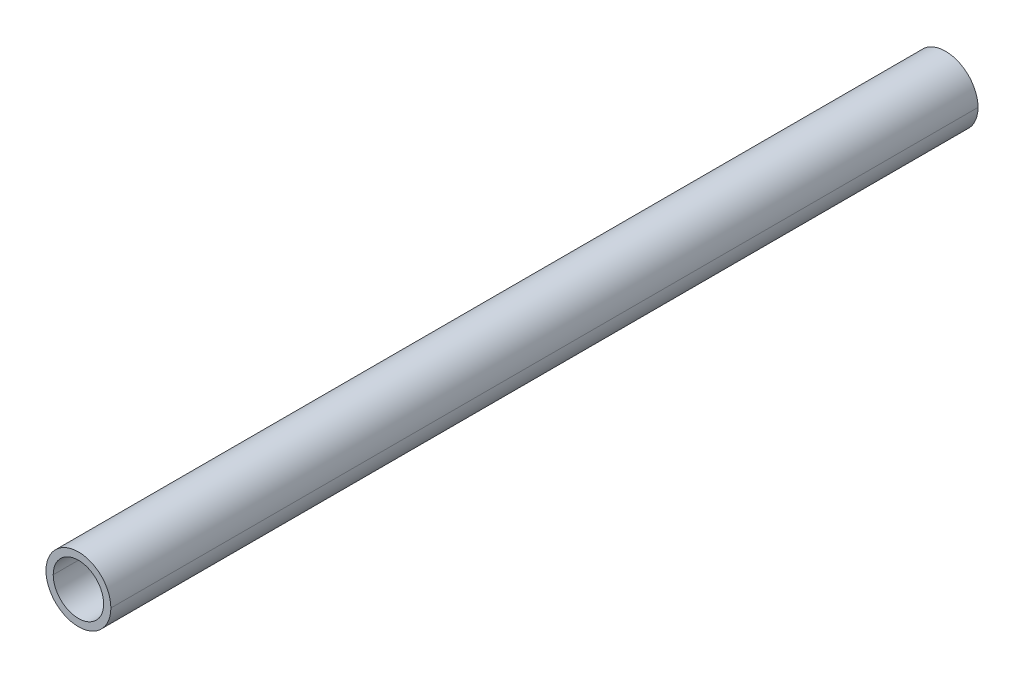
ISO-10303-21;
HEADER;
FILE_DESCRIPTION(('STEP AP214'),'2;1');
FILE_NAME('part.step','',(''),(''),'','','');
FILE_SCHEMA(('AUTOMOTIVE_DESIGN { 1 0 10303 214 1 1 1 1 }'));
ENDSEC;
DATA;
#1=APPLICATION_CONTEXT('core data for automotive mechanical design processes');
#2=APPLICATION_PROTOCOL_DEFINITION('international standard','automotive_design',2000,#1);
#3=PRODUCT_CONTEXT('',#1,'mechanical');
#4=PRODUCT('Part','Part','',(#3));
#5=PRODUCT_RELATED_PRODUCT_CATEGORY('part','',(#4));
#6=PRODUCT_DEFINITION_FORMATION('','',#4);
#7=PRODUCT_DEFINITION_CONTEXT('part definition',#1,'design');
#8=PRODUCT_DEFINITION('design','',#6,#7);
#9=PRODUCT_DEFINITION_SHAPE('','',#8);
#10=(LENGTH_UNIT() NAMED_UNIT(*) SI_UNIT(.MILLI.,.METRE.));
#11=(NAMED_UNIT(*) PLANE_ANGLE_UNIT() SI_UNIT($,.RADIAN.));
#12=(NAMED_UNIT(*) SI_UNIT($,.STERADIAN.) SOLID_ANGLE_UNIT());
#13=UNCERTAINTY_MEASURE_WITH_UNIT(LENGTH_MEASURE(1.E-05),#10,'distance_accuracy_value','');
#14=(GEOMETRIC_REPRESENTATION_CONTEXT(3) GLOBAL_UNCERTAINTY_ASSIGNED_CONTEXT((#13)) GLOBAL_UNIT_ASSIGNED_CONTEXT((#10,
#11,#12)) REPRESENTATION_CONTEXT('',''));
#15=CARTESIAN_POINT('',(0.,0.,0.));
#16=DIRECTION('',(0.,0.,1.));
#17=DIRECTION('',(1.,0.,0.));
#18=AXIS2_PLACEMENT_3D('',#15,#16,#17);
#19=CARTESIAN_POINT('',(0.,0.,240.71));
#20=DIRECTION('',(0.,0.,-1.));
#21=DIRECTION('',(-1.,0.,0.));
#22=AXIS2_PLACEMENT_3D('',#19,#20,#21);
#23=CYLINDRICAL_SURFACE('',#22,7.);
#24=DIRECTION('',(0.,0.,-1.));
#25=VECTOR('',#24,1.);
#26=CARTESIAN_POINT('',(7.,0.,240.71));
#27=LINE('',#26,#25);
#28=CARTESIAN_POINT('',(7.,0.,240.71));
#29=VERTEX_POINT('',#28);
#30=CARTESIAN_POINT('',(7.,0.,0.));
#31=VERTEX_POINT('',#30);
#32=EDGE_CURVE('E20',#29,#31,#27,.T.);
#33=ORIENTED_EDGE('',*,*,#32,.F.);
#34=CARTESIAN_POINT('',(0.,0.,240.71));
#35=DIRECTION('',(0.,0.,1.));
#36=DIRECTION('',(1.,0.,0.));
#37=AXIS2_PLACEMENT_3D('',#34,#35,#36);
#38=CIRCLE('',#37,7.);
#39=CARTESIAN_POINT('',(-7.,0.,240.71));
#40=VERTEX_POINT('',#39);
#41=EDGE_CURVE('E73',#29,#40,#38,.T.);
#42=ORIENTED_EDGE('',*,*,#41,.T.);
#43=DIRECTION('',(0.,0.,-1.));
#44=VECTOR('',#43,1.);
#45=CARTESIAN_POINT('',(-7.,0.,240.71));
#46=LINE('',#45,#44);
#47=CARTESIAN_POINT('',(-7.,0.,0.));
#48=VERTEX_POINT('',#47);
#49=EDGE_CURVE('E85',#40,#48,#46,.T.);
#50=ORIENTED_EDGE('',*,*,#49,.T.);
#51=CARTESIAN_POINT('',(0.,0.,0.));
#52=DIRECTION('',(0.,0.,1.));
#53=DIRECTION('',(1.,0.,0.));
#54=AXIS2_PLACEMENT_3D('',#51,#52,#53);
#55=CIRCLE('',#54,7.);
#56=EDGE_CURVE('E11',#31,#48,#55,.T.);
#57=ORIENTED_EDGE('',*,*,#56,.F.);
#58=EDGE_LOOP('',(#33,#42,#50,#57));
#59=FACE_BOUND('',#58,.T.);
#60=ADVANCED_FACE('F16',(#59),#23,.F.);
#61=CARTESIAN_POINT('',(0.,0.,240.71));
#62=DIRECTION('',(0.,0.,-1.));
#63=DIRECTION('',(-1.,0.,0.));
#64=AXIS2_PLACEMENT_3D('',#61,#62,#63);
#65=CYLINDRICAL_SURFACE('',#64,9.);
#66=DIRECTION('',(0.,0.,-1.));
#67=VECTOR('',#66,1.);
#68=CARTESIAN_POINT('',(9.,0.,240.71));
#69=LINE('',#68,#67);
#70=CARTESIAN_POINT('',(9.,0.,240.71));
#71=VERTEX_POINT('',#70);
#72=CARTESIAN_POINT('',(9.,0.,0.));
#73=VERTEX_POINT('',#72);
#74=EDGE_CURVE('E76',#71,#73,#69,.T.);
#75=ORIENTED_EDGE('',*,*,#74,.F.);
#76=CARTESIAN_POINT('',(0.,0.,240.71));
#77=DIRECTION('',(0.,0.,1.));
#78=DIRECTION('',(1.,0.,0.));
#79=AXIS2_PLACEMENT_3D('',#76,#77,#78);
#80=CIRCLE('',#79,9.);
#81=CARTESIAN_POINT('',(-9.,0.,240.71));
#82=VERTEX_POINT('',#81);
#83=EDGE_CURVE('E62',#82,#71,#80,.T.);
#84=ORIENTED_EDGE('',*,*,#83,.F.);
#85=DIRECTION('',(0.,0.,-1.));
#86=VECTOR('',#85,1.);
#87=CARTESIAN_POINT('',(-9.,0.,240.71));
#88=LINE('',#87,#86);
#89=CARTESIAN_POINT('',(-9.,0.,0.));
#90=VERTEX_POINT('',#89);
#91=EDGE_CURVE('E74',#82,#90,#88,.T.);
#92=ORIENTED_EDGE('',*,*,#91,.T.);
#93=CARTESIAN_POINT('',(0.,0.,0.));
#94=DIRECTION('',(0.,0.,1.));
#95=DIRECTION('',(1.,0.,0.));
#96=AXIS2_PLACEMENT_3D('',#93,#94,#95);
#97=CIRCLE('',#96,9.);
#98=EDGE_CURVE('E27',#90,#73,#97,.T.);
#99=ORIENTED_EDGE('',*,*,#98,.T.);
#100=EDGE_LOOP('',(#75,#84,#92,#99));
#101=FACE_BOUND('',#100,.T.);
#102=ADVANCED_FACE('F77',(#101),#65,.T.);
#103=CARTESIAN_POINT('',(0.,0.,0.));
#104=DIRECTION('',(0.,0.,1.));
#105=DIRECTION('',(1.,0.,0.));
#106=AXIS2_PLACEMENT_3D('',#103,#104,#105);
#107=PLANE('',#106);
#108=CARTESIAN_POINT('',(0.,0.,0.));
#109=DIRECTION('',(0.,0.,1.));
#110=DIRECTION('',(1.,0.,0.));
#111=AXIS2_PLACEMENT_3D('',#108,#109,#110);
#112=CIRCLE('',#111,7.);
#113=EDGE_CURVE('E92',#48,#31,#112,.T.);
#114=ORIENTED_EDGE('',*,*,#113,.T.);
#115=ORIENTED_EDGE('',*,*,#56,.T.);
#116=EDGE_LOOP('',(#114,#115));
#117=FACE_BOUND('',#116,.T.);
#118=ORIENTED_EDGE('',*,*,#98,.F.);
#119=CARTESIAN_POINT('',(0.,0.,0.));
#120=DIRECTION('',(0.,0.,1.));
#121=DIRECTION('',(1.,0.,0.));
#122=AXIS2_PLACEMENT_3D('',#119,#120,#121);
#123=CIRCLE('',#122,9.);
#124=EDGE_CURVE('E81',#73,#90,#123,.T.);
#125=ORIENTED_EDGE('',*,*,#124,.F.);
#126=EDGE_LOOP('',(#118,#125));
#127=FACE_BOUND('',#126,.T.);
#128=ADVANCED_FACE('F18',(#117,#127),#107,.F.);
#129=CARTESIAN_POINT('',(0.,0.,240.71));
#130=DIRECTION('',(0.,0.,1.));
#131=DIRECTION('',(1.,0.,0.));
#132=AXIS2_PLACEMENT_3D('',#129,#130,#131);
#133=PLANE('',#132);
#134=CARTESIAN_POINT('',(0.,0.,240.71));
#135=DIRECTION('',(0.,0.,1.));
#136=DIRECTION('',(1.,0.,0.));
#137=AXIS2_PLACEMENT_3D('',#134,#135,#136);
#138=CIRCLE('',#137,7.);
#139=EDGE_CURVE('E98',#40,#29,#138,.T.);
#140=ORIENTED_EDGE('',*,*,#139,.F.);
#141=ORIENTED_EDGE('',*,*,#41,.F.);
#142=EDGE_LOOP('',(#140,#141));
#143=FACE_BOUND('',#142,.T.);
#144=ORIENTED_EDGE('',*,*,#83,.T.);
#145=CARTESIAN_POINT('',(0.,0.,240.71));
#146=DIRECTION('',(0.,0.,1.));
#147=DIRECTION('',(1.,0.,0.));
#148=AXIS2_PLACEMENT_3D('',#145,#146,#147);
#149=CIRCLE('',#148,9.);
#150=EDGE_CURVE('E71',#71,#82,#149,.T.);
#151=ORIENTED_EDGE('',*,*,#150,.T.);
#152=EDGE_LOOP('',(#144,#151));
#153=FACE_BOUND('',#152,.T.);
#154=ADVANCED_FACE('F69',(#143,#153),#133,.T.);
#155=CARTESIAN_POINT('',(0.,0.,240.71));
#156=DIRECTION('',(0.,0.,-1.));
#157=DIRECTION('',(-1.,0.,0.));
#158=AXIS2_PLACEMENT_3D('',#155,#156,#157);
#159=CYLINDRICAL_SURFACE('',#158,9.);
#160=ORIENTED_EDGE('',*,*,#150,.F.);
#161=ORIENTED_EDGE('',*,*,#74,.T.);
#162=ORIENTED_EDGE('',*,*,#124,.T.);
#163=ORIENTED_EDGE('',*,*,#91,.F.);
#164=EDGE_LOOP('',(#160,#161,#162,#163));
#165=FACE_BOUND('',#164,.T.);
#166=ADVANCED_FACE('F83',(#165),#159,.T.);
#167=CARTESIAN_POINT('',(0.,0.,240.71));
#168=DIRECTION('',(0.,0.,-1.));
#169=DIRECTION('',(-1.,0.,0.));
#170=AXIS2_PLACEMENT_3D('',#167,#168,#169);
#171=CYLINDRICAL_SURFACE('',#170,7.);
#172=ORIENTED_EDGE('',*,*,#139,.T.);
#173=ORIENTED_EDGE('',*,*,#32,.T.);
#174=ORIENTED_EDGE('',*,*,#113,.F.);
#175=ORIENTED_EDGE('',*,*,#49,.F.);
#176=EDGE_LOOP('',(#172,#173,#174,#175));
#177=FACE_BOUND('',#176,.T.);
#178=ADVANCED_FACE('F120',(#177),#171,.F.);
#179=CLOSED_SHELL('',(#60,#102,#128,#154,#166,#178));
#180=MANIFOLD_SOLID_BREP('B1',#179);
#181=ADVANCED_BREP_SHAPE_REPRESENTATION('',(#18,#180),#14);
#182=SHAPE_DEFINITION_REPRESENTATION(#9,#181);
ENDSEC;
END-ISO-10303-21;
